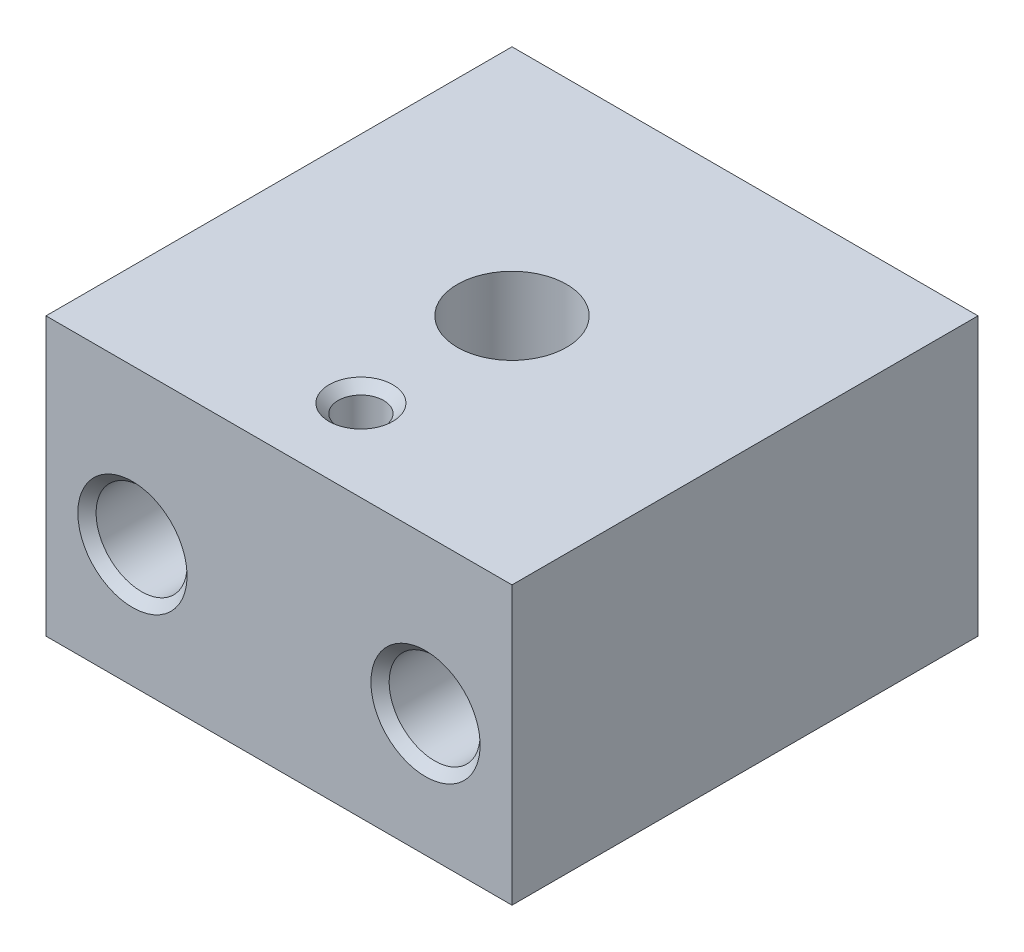
ISO-10303-21;
HEADER;
FILE_DESCRIPTION(('STEP AP214'),'2;1');
FILE_NAME('part.step','',(''),(''),'','','');
FILE_SCHEMA(('AUTOMOTIVE_DESIGN { 1 0 10303 214 1 1 1 1 }'));
ENDSEC;
DATA;
#1=APPLICATION_CONTEXT('core data for automotive mechanical design processes');
#2=APPLICATION_PROTOCOL_DEFINITION('international standard','automotive_design',2000,#1);
#3=PRODUCT_CONTEXT('',#1,'mechanical');
#4=PRODUCT('Part','Part','',(#3));
#5=PRODUCT_RELATED_PRODUCT_CATEGORY('part','',(#4));
#6=PRODUCT_DEFINITION_FORMATION('','',#4);
#7=PRODUCT_DEFINITION_CONTEXT('part definition',#1,'design');
#8=PRODUCT_DEFINITION('design','',#6,#7);
#9=PRODUCT_DEFINITION_SHAPE('','',#8);
#10=(LENGTH_UNIT() NAMED_UNIT(*) SI_UNIT(.MILLI.,.METRE.));
#11=(NAMED_UNIT(*) PLANE_ANGLE_UNIT() SI_UNIT($,.RADIAN.));
#12=(NAMED_UNIT(*) SI_UNIT($,.STERADIAN.) SOLID_ANGLE_UNIT());
#13=UNCERTAINTY_MEASURE_WITH_UNIT(LENGTH_MEASURE(1.E-05),#10,'distance_accuracy_value','');
#14=(GEOMETRIC_REPRESENTATION_CONTEXT(3) GLOBAL_UNCERTAINTY_ASSIGNED_CONTEXT((#13)) GLOBAL_UNIT_ASSIGNED_CONTEXT((#10,
#11,#12)) REPRESENTATION_CONTEXT('',''));
#15=CARTESIAN_POINT('',(0.,0.,0.));
#16=DIRECTION('',(0.,0.,1.));
#17=DIRECTION('',(1.,0.,0.));
#18=AXIS2_PLACEMENT_3D('',#15,#16,#17);
#19=CARTESIAN_POINT('',(-12.8,15.24,-12.8));
#20=DIRECTION('',(1.,0.,0.));
#21=DIRECTION('',(0.,0.,-1.));
#22=AXIS2_PLACEMENT_3D('',#19,#20,#21);
#23=PLANE('',#22);
#24=DIRECTION('',(0.,0.,1.));
#25=VECTOR('',#24,1.);
#26=CARTESIAN_POINT('',(-12.8,0.,-12.8));
#27=LINE('',#26,#25);
#28=CARTESIAN_POINT('',(-12.8,0.,-12.8));
#29=VERTEX_POINT('',#28);
#30=CARTESIAN_POINT('',(-12.8,0.,12.8));
#31=VERTEX_POINT('',#30);
#32=EDGE_CURVE('E112',#29,#31,#27,.T.);
#33=ORIENTED_EDGE('',*,*,#32,.T.);
#34=DIRECTION('',(0.,-1.,0.));
#35=VECTOR('',#34,1.);
#36=CARTESIAN_POINT('',(-12.8,15.24,12.8));
#37=LINE('',#36,#35);
#38=CARTESIAN_POINT('',(-12.8,15.24,12.8));
#39=VERTEX_POINT('',#38);
#40=EDGE_CURVE('E103',#39,#31,#37,.T.);
#41=ORIENTED_EDGE('',*,*,#40,.F.);
#42=DIRECTION('',(0.,0.,1.));
#43=VECTOR('',#42,1.);
#44=CARTESIAN_POINT('',(-12.8,15.24,-12.8));
#45=LINE('',#44,#43);
#46=CARTESIAN_POINT('',(-12.8,15.24,-12.8));
#47=VERTEX_POINT('',#46);
#48=EDGE_CURVE('E97',#47,#39,#45,.T.);
#49=ORIENTED_EDGE('',*,*,#48,.F.);
#50=DIRECTION('',(0.,-1.,0.));
#51=VECTOR('',#50,1.);
#52=CARTESIAN_POINT('',(-12.8,15.24,-12.8));
#53=LINE('',#52,#51);
#54=EDGE_CURVE('E108',#47,#29,#53,.T.);
#55=ORIENTED_EDGE('',*,*,#54,.T.);
#56=EDGE_LOOP('',(#33,#41,#49,#55));
#57=FACE_BOUND('',#56,.T.);
#58=ADVANCED_FACE('F44',(#57),#23,.F.);
#59=CARTESIAN_POINT('',(-12.8,15.24,12.8));
#60=DIRECTION('',(0.,0.,-1.));
#61=DIRECTION('',(-1.,0.,0.));
#62=AXIS2_PLACEMENT_3D('',#59,#60,#61);
#63=PLANE('',#62);
#64=CARTESIAN_POINT('',(-8.05,6.74,12.8));
#65=DIRECTION('',(0.,0.,-1.));
#66=DIRECTION('',(-1.,0.,0.));
#67=AXIS2_PLACEMENT_3D('',#64,#65,#66);
#68=CIRCLE('',#67,3.);
#69=CARTESIAN_POINT('',(-11.05,6.74,12.8));
#70=VERTEX_POINT('',#69);
#71=EDGE_CURVE('E144',#70,#70,#68,.T.);
#72=ORIENTED_EDGE('',*,*,#71,.T.);
#73=EDGE_LOOP('',(#72));
#74=FACE_BOUND('',#73,.T.);
#75=CARTESIAN_POINT('',(8.05,6.74,12.8));
#76=DIRECTION('',(0.,0.,-1.));
#77=DIRECTION('',(-1.,0.,0.));
#78=AXIS2_PLACEMENT_3D('',#75,#76,#77);
#79=CIRCLE('',#78,3.);
#80=CARTESIAN_POINT('',(5.05,6.74,12.8));
#81=VERTEX_POINT('',#80);
#82=EDGE_CURVE('E141',#81,#81,#79,.T.);
#83=ORIENTED_EDGE('',*,*,#82,.T.);
#84=EDGE_LOOP('',(#83));
#85=FACE_BOUND('',#84,.T.);
#86=DIRECTION('',(1.,0.,0.));
#87=VECTOR('',#86,1.);
#88=CARTESIAN_POINT('',(-12.8,0.,12.8));
#89=LINE('',#88,#87);
#90=CARTESIAN_POINT('',(12.8,0.,12.8));
#91=VERTEX_POINT('',#90);
#92=EDGE_CURVE('E102',#31,#91,#89,.T.);
#93=ORIENTED_EDGE('',*,*,#92,.T.);
#94=DIRECTION('',(0.,-1.,0.));
#95=VECTOR('',#94,1.);
#96=CARTESIAN_POINT('',(12.8,15.24,12.8));
#97=LINE('',#96,#95);
#98=CARTESIAN_POINT('',(12.8,15.24,12.8));
#99=VERTEX_POINT('',#98);
#100=EDGE_CURVE('E100',#99,#91,#97,.T.);
#101=ORIENTED_EDGE('',*,*,#100,.F.);
#102=DIRECTION('',(1.,0.,0.));
#103=VECTOR('',#102,1.);
#104=CARTESIAN_POINT('',(-12.8,15.24,12.8));
#105=LINE('',#104,#103);
#106=EDGE_CURVE('E92',#39,#99,#105,.T.);
#107=ORIENTED_EDGE('',*,*,#106,.F.);
#108=ORIENTED_EDGE('',*,*,#40,.T.);
#109=EDGE_LOOP('',(#93,#101,#107,#108));
#110=FACE_BOUND('',#109,.T.);
#111=ADVANCED_FACE('F101',(#74,#85,#110),#63,.F.);
#112=CARTESIAN_POINT('',(12.8,15.24,-12.8));
#113=DIRECTION('',(-1.,0.,0.));
#114=DIRECTION('',(0.,0.,1.));
#115=AXIS2_PLACEMENT_3D('',#112,#113,#114);
#116=PLANE('',#115);
#117=DIRECTION('',(0.,0.,-1.));
#118=VECTOR('',#117,1.);
#119=CARTESIAN_POINT('',(12.8,0.,-12.8));
#120=LINE('',#119,#118);
#121=CARTESIAN_POINT('',(12.8,0.,-12.8));
#122=VERTEX_POINT('',#121);
#123=EDGE_CURVE('E78',#91,#122,#120,.T.);
#124=ORIENTED_EDGE('',*,*,#123,.T.);
#125=DIRECTION('',(0.,-1.,0.));
#126=VECTOR('',#125,1.);
#127=CARTESIAN_POINT('',(12.8,15.24,-12.8));
#128=LINE('',#127,#126);
#129=CARTESIAN_POINT('',(12.8,15.24,-12.8));
#130=VERTEX_POINT('',#129);
#131=EDGE_CURVE('E104',#130,#122,#128,.T.);
#132=ORIENTED_EDGE('',*,*,#131,.F.);
#133=DIRECTION('',(0.,0.,-1.));
#134=VECTOR('',#133,1.);
#135=CARTESIAN_POINT('',(12.8,15.24,-12.8));
#136=LINE('',#135,#134);
#137=EDGE_CURVE('E95',#99,#130,#136,.T.);
#138=ORIENTED_EDGE('',*,*,#137,.F.);
#139=ORIENTED_EDGE('',*,*,#100,.T.);
#140=EDGE_LOOP('',(#124,#132,#138,#139));
#141=FACE_BOUND('',#140,.T.);
#142=ADVANCED_FACE('F106',(#141),#116,.F.);
#143=CARTESIAN_POINT('',(-12.8,15.24,-12.8));
#144=DIRECTION('',(0.,0.,1.));
#145=DIRECTION('',(1.,0.,0.));
#146=AXIS2_PLACEMENT_3D('',#143,#144,#145);
#147=PLANE('',#146);
#148=CARTESIAN_POINT('',(-8.05,6.74,-12.8));
#149=DIRECTION('',(0.,0.,1.));
#150=DIRECTION('',(1.,0.,0.));
#151=AXIS2_PLACEMENT_3D('',#148,#149,#150);
#152=CIRCLE('',#151,3.);
#153=CARTESIAN_POINT('',(-5.04999999999999,6.74,-12.8));
#154=VERTEX_POINT('',#153);
#155=EDGE_CURVE('E150',#154,#154,#152,.T.);
#156=ORIENTED_EDGE('',*,*,#155,.T.);
#157=EDGE_LOOP('',(#156));
#158=FACE_BOUND('',#157,.T.);
#159=CARTESIAN_POINT('',(8.05,6.74,-12.8));
#160=DIRECTION('',(0.,0.,1.));
#161=DIRECTION('',(1.,0.,0.));
#162=AXIS2_PLACEMENT_3D('',#159,#160,#161);
#163=CIRCLE('',#162,3.);
#164=CARTESIAN_POINT('',(11.05,6.74,-12.8));
#165=VERTEX_POINT('',#164);
#166=EDGE_CURVE('E147',#165,#165,#163,.T.);
#167=ORIENTED_EDGE('',*,*,#166,.T.);
#168=EDGE_LOOP('',(#167));
#169=FACE_BOUND('',#168,.T.);
#170=DIRECTION('',(-1.,0.,0.));
#171=VECTOR('',#170,1.);
#172=CARTESIAN_POINT('',(-12.8,0.,-12.8));
#173=LINE('',#172,#171);
#174=EDGE_CURVE('E84',#122,#29,#173,.T.);
#175=ORIENTED_EDGE('',*,*,#174,.T.);
#176=ORIENTED_EDGE('',*,*,#54,.F.);
#177=DIRECTION('',(-1.,0.,0.));
#178=VECTOR('',#177,1.);
#179=CARTESIAN_POINT('',(-12.8,15.24,-12.8));
#180=LINE('',#179,#178);
#181=EDGE_CURVE('E61',#130,#47,#180,.T.);
#182=ORIENTED_EDGE('',*,*,#181,.F.);
#183=ORIENTED_EDGE('',*,*,#131,.T.);
#184=EDGE_LOOP('',(#175,#176,#182,#183));
#185=FACE_BOUND('',#184,.T.);
#186=ADVANCED_FACE('F163',(#158,#169,#185),#147,.F.);
#187=CARTESIAN_POINT('',(-12.8,15.24,12.8));
#188=DIRECTION('',(0.,1.,0.));
#189=DIRECTION('',(0.,0.,1.));
#190=AXIS2_PLACEMENT_3D('',#187,#188,#189);
#191=PLANE('',#190);
#192=CARTESIAN_POINT('',(0.,15.24,0.));
#193=DIRECTION('',(0.,1.,0.));
#194=DIRECTION('',(0.,0.,1.));
#195=AXIS2_PLACEMENT_3D('',#192,#193,#194);
#196=CIRCLE('',#195,3.);
#197=CARTESIAN_POINT('',(0.,15.24,3.));
#198=VERTEX_POINT('',#197);
#199=EDGE_CURVE('E232',#198,#198,#196,.T.);
#200=ORIENTED_EDGE('',*,*,#199,.F.);
#201=EDGE_LOOP('',(#200));
#202=FACE_BOUND('',#201,.T.);
#203=CARTESIAN_POINT('',(0.,15.24,8.3));
#204=DIRECTION('',(0.,1.,0.));
#205=DIRECTION('',(0.,0.,1.));
#206=AXIS2_PLACEMENT_3D('',#203,#204,#205);
#207=CIRCLE('',#206,1.75000000000002);
#208=CARTESIAN_POINT('',(0.,15.24,10.05));
#209=VERTEX_POINT('',#208);
#210=EDGE_CURVE('E129',#209,#209,#207,.F.);
#211=ORIENTED_EDGE('',*,*,#210,.T.);
#212=EDGE_LOOP('',(#211));
#213=FACE_BOUND('',#212,.T.);
#214=ORIENTED_EDGE('',*,*,#48,.T.);
#215=ORIENTED_EDGE('',*,*,#106,.T.);
#216=ORIENTED_EDGE('',*,*,#137,.T.);
#217=ORIENTED_EDGE('',*,*,#181,.T.);
#218=EDGE_LOOP('',(#214,#215,#216,#217));
#219=FACE_BOUND('',#218,.T.);
#220=ADVANCED_FACE('F93',(#202,#213,#219),#191,.T.);
#221=CARTESIAN_POINT('',(-12.8,0.,12.8));
#222=DIRECTION('',(0.,1.,0.));
#223=DIRECTION('',(0.,0.,1.));
#224=AXIS2_PLACEMENT_3D('',#221,#222,#223);
#225=PLANE('',#224);
#226=CARTESIAN_POINT('',(0.,0.,0.));
#227=DIRECTION('',(0.,1.,0.));
#228=DIRECTION('',(0.,0.,1.));
#229=AXIS2_PLACEMENT_3D('',#226,#227,#228);
#230=CIRCLE('',#229,3.);
#231=CARTESIAN_POINT('',(0.,0.,3.));
#232=VERTEX_POINT('',#231);
#233=EDGE_CURVE('E114',#232,#232,#230,.T.);
#234=ORIENTED_EDGE('',*,*,#233,.T.);
#235=EDGE_LOOP('',(#234));
#236=FACE_BOUND('',#235,.T.);
#237=CARTESIAN_POINT('',(0.,0.,8.3));
#238=DIRECTION('',(0.,1.,0.));
#239=DIRECTION('',(0.,0.,1.));
#240=AXIS2_PLACEMENT_3D('',#237,#238,#239);
#241=CIRCLE('',#240,1.74999999999998);
#242=CARTESIAN_POINT('',(0.,0.,10.05));
#243=VERTEX_POINT('',#242);
#244=EDGE_CURVE('E132',#243,#243,#241,.T.);
#245=ORIENTED_EDGE('',*,*,#244,.T.);
#246=EDGE_LOOP('',(#245));
#247=FACE_BOUND('',#246,.T.);
#248=ORIENTED_EDGE('',*,*,#32,.F.);
#249=ORIENTED_EDGE('',*,*,#174,.F.);
#250=ORIENTED_EDGE('',*,*,#123,.F.);
#251=ORIENTED_EDGE('',*,*,#92,.F.);
#252=EDGE_LOOP('',(#248,#249,#250,#251));
#253=FACE_BOUND('',#252,.T.);
#254=ADVANCED_FACE('F171',(#236,#247,#253),#225,.F.);
#255=CARTESIAN_POINT('',(-8.05,6.74,-12.8));
#256=DIRECTION('',(0.,0.,1.));
#257=DIRECTION('',(1.,0.,0.));
#258=AXIS2_PLACEMENT_3D('',#255,#256,#257);
#259=CYLINDRICAL_SURFACE('',#258,2.5);
#260=CARTESIAN_POINT('',(-8.05,6.74,12.3));
#261=DIRECTION('',(0.,0.,-1.));
#262=DIRECTION('',(-1.,0.,0.));
#263=AXIS2_PLACEMENT_3D('',#260,#261,#262);
#264=CIRCLE('',#263,2.5);
#265=CARTESIAN_POINT('',(-10.55,6.74,12.3));
#266=VERTEX_POINT('',#265);
#267=EDGE_CURVE('E138',#266,#266,#264,.F.);
#268=ORIENTED_EDGE('',*,*,#267,.T.);
#269=EDGE_LOOP('',(#268));
#270=FACE_BOUND('',#269,.T.);
#271=CARTESIAN_POINT('',(-8.05,6.74,-12.3));
#272=DIRECTION('',(0.,0.,1.));
#273=DIRECTION('',(1.,0.,0.));
#274=AXIS2_PLACEMENT_3D('',#271,#272,#273);
#275=CIRCLE('',#274,2.5);
#276=CARTESIAN_POINT('',(-5.54999999999999,6.74,-12.3));
#277=VERTEX_POINT('',#276);
#278=EDGE_CURVE('E135',#277,#277,#275,.F.);
#279=ORIENTED_EDGE('',*,*,#278,.T.);
#280=EDGE_LOOP('',(#279));
#281=FACE_BOUND('',#280,.T.);
#282=ADVANCED_FACE('F210',(#270,#281),#259,.F.);
#283=CARTESIAN_POINT('',(8.05,6.74,-12.8));
#284=DIRECTION('',(0.,0.,1.));
#285=DIRECTION('',(1.,0.,0.));
#286=AXIS2_PLACEMENT_3D('',#283,#284,#285);
#287=CYLINDRICAL_SURFACE('',#286,2.5);
#288=CARTESIAN_POINT('',(8.05,6.74,12.3));
#289=DIRECTION('',(0.,0.,-1.));
#290=DIRECTION('',(-1.,0.,0.));
#291=AXIS2_PLACEMENT_3D('',#288,#289,#290);
#292=CIRCLE('',#291,2.5);
#293=CARTESIAN_POINT('',(5.55,6.74,12.3));
#294=VERTEX_POINT('',#293);
#295=EDGE_CURVE('E12',#294,#294,#292,.F.);
#296=ORIENTED_EDGE('',*,*,#295,.T.);
#297=EDGE_LOOP('',(#296));
#298=FACE_BOUND('',#297,.T.);
#299=CARTESIAN_POINT('',(8.05,6.74,-12.3));
#300=DIRECTION('',(0.,0.,1.));
#301=DIRECTION('',(1.,0.,0.));
#302=AXIS2_PLACEMENT_3D('',#299,#300,#301);
#303=CIRCLE('',#302,2.5);
#304=CARTESIAN_POINT('',(10.55,6.74,-12.3));
#305=VERTEX_POINT('',#304);
#306=EDGE_CURVE('E53',#305,#305,#303,.F.);
#307=ORIENTED_EDGE('',*,*,#306,.T.);
#308=EDGE_LOOP('',(#307));
#309=FACE_BOUND('',#308,.T.);
#310=ADVANCED_FACE('F155',(#298,#309),#287,.F.);
#311=CARTESIAN_POINT('',(0.,0.,8.3));
#312=DIRECTION('',(0.,1.,0.));
#313=DIRECTION('',(0.,0.,1.));
#314=AXIS2_PLACEMENT_3D('',#311,#312,#313);
#315=CYLINDRICAL_SURFACE('',#314,1.25);
#316=CARTESIAN_POINT('',(0.,14.74,8.3));
#317=DIRECTION('',(0.,1.,0.));
#318=DIRECTION('',(0.,0.,1.));
#319=AXIS2_PLACEMENT_3D('',#316,#317,#318);
#320=CIRCLE('',#319,1.25);
#321=CARTESIAN_POINT('',(0.,14.74,9.55));
#322=VERTEX_POINT('',#321);
#323=EDGE_CURVE('E126',#322,#322,#320,.T.);
#324=CARTESIAN_POINT('',(0.,0.49999999999999,8.3));
#325=DIRECTION('',(0.,1.,0.));
#326=DIRECTION('',(0.,0.,1.));
#327=AXIS2_PLACEMENT_3D('',#324,#325,#326);
#328=CIRCLE('',#327,1.25);
#329=CARTESIAN_POINT('',(0.,0.49999999999999,9.55));
#330=VERTEX_POINT('',#329);
#331=EDGE_CURVE('E123',#330,#330,#328,.F.);
#332=CARTESIAN_POINT('',(0.,14.74,9.55));
#333=CARTESIAN_POINT('',(0.,14.5916666666666,9.55));
#334=CARTESIAN_POINT('',(0.,14.4433333333333,9.55));
#335=CARTESIAN_POINT('',(0.,14.1466666666666,9.55));
#336=CARTESIAN_POINT('',(0.,13.9983333333333,9.55));
#337=CARTESIAN_POINT('',(0.,13.7016666666666,9.55));
#338=CARTESIAN_POINT('',(0.,13.5533333333333,9.55));
#339=CARTESIAN_POINT('',(0.,13.2566666666666,9.55));
#340=CARTESIAN_POINT('',(0.,13.1083333333333,9.55));
#341=CARTESIAN_POINT('',(0.,12.8116666666666,9.55));
#342=CARTESIAN_POINT('',(0.,12.6633333333333,9.55));
#343=CARTESIAN_POINT('',(0.,12.3666666666666,9.55));
#344=CARTESIAN_POINT('',(0.,12.2183333333333,9.55));
#345=CARTESIAN_POINT('',(0.,11.9216666666666,9.55));
#346=CARTESIAN_POINT('',(0.,11.7733333333333,9.55));
#347=CARTESIAN_POINT('',(0.,11.4766666666666,9.55));
#348=CARTESIAN_POINT('',(0.,11.3283333333333,9.55));
#349=CARTESIAN_POINT('',(0.,11.0316666666666,9.55));
#350=CARTESIAN_POINT('',(0.,10.8833333333333,9.55));
#351=CARTESIAN_POINT('',(0.,10.5866666666666,9.55));
#352=CARTESIAN_POINT('',(0.,10.4383333333333,9.55));
#353=CARTESIAN_POINT('',(0.,10.1416666666666,9.55));
#354=CARTESIAN_POINT('',(0.,9.99333333333331,9.55));
#355=CARTESIAN_POINT('',(0.,9.69666666666665,9.55));
#356=CARTESIAN_POINT('',(0.,9.54833333333331,9.55));
#357=CARTESIAN_POINT('',(0.,9.25166666666665,9.55));
#358=CARTESIAN_POINT('',(0.,9.10333333333332,9.55));
#359=CARTESIAN_POINT('',(0.,8.80666666666665,9.55));
#360=CARTESIAN_POINT('',(0.,8.65833333333332,9.55));
#361=CARTESIAN_POINT('',(0.,8.36166666666665,9.55));
#362=CARTESIAN_POINT('',(0.,8.21333333333332,9.55));
#363=CARTESIAN_POINT('',(0.,7.91666666666665,9.55));
#364=CARTESIAN_POINT('',(0.,7.76833333333332,9.55));
#365=CARTESIAN_POINT('',(0.,7.47166666666665,9.55));
#366=CARTESIAN_POINT('',(0.,7.32333333333332,9.55));
#367=CARTESIAN_POINT('',(0.,7.02666666666665,9.55));
#368=CARTESIAN_POINT('',(0.,6.87833333333332,9.55));
#369=CARTESIAN_POINT('',(0.,6.58166666666665,9.55));
#370=CARTESIAN_POINT('',(0.,6.43333333333332,9.55));
#371=CARTESIAN_POINT('',(0.,6.13666666666665,9.55));
#372=CARTESIAN_POINT('',(0.,5.98833333333332,9.55));
#373=CARTESIAN_POINT('',(0.,5.69166666666665,9.55));
#374=CARTESIAN_POINT('',(0.,5.54333333333332,9.55));
#375=CARTESIAN_POINT('',(0.,5.24666666666665,9.55));
#376=CARTESIAN_POINT('',(0.,5.09833333333332,9.55));
#377=CARTESIAN_POINT('',(0.,4.80166666666665,9.55));
#378=CARTESIAN_POINT('',(0.,4.65333333333332,9.55));
#379=CARTESIAN_POINT('',(0.,4.35666666666665,9.55));
#380=CARTESIAN_POINT('',(0.,4.20833333333332,9.55));
#381=CARTESIAN_POINT('',(0.,3.91166666666665,9.55));
#382=CARTESIAN_POINT('',(0.,3.76333333333332,9.55));
#383=CARTESIAN_POINT('',(0.,3.46666666666665,9.55));
#384=CARTESIAN_POINT('',(0.,3.31833333333332,9.55));
#385=CARTESIAN_POINT('',(0.,3.02166666666665,9.55));
#386=CARTESIAN_POINT('',(0.,2.87333333333332,9.55));
#387=CARTESIAN_POINT('',(0.,2.57666666666665,9.55));
#388=CARTESIAN_POINT('',(0.,2.42833333333332,9.55));
#389=CARTESIAN_POINT('',(0.,2.13166666666666,9.55));
#390=CARTESIAN_POINT('',(0.,1.98333333333332,9.55));
#391=CARTESIAN_POINT('',(0.,1.68666666666666,9.55));
#392=CARTESIAN_POINT('',(0.,1.53833333333332,9.55));
#393=CARTESIAN_POINT('',(0.,1.24166666666666,9.55));
#394=CARTESIAN_POINT('',(0.,1.09333333333332,9.55));
#395=CARTESIAN_POINT('',(0.,0.796666666666656,9.55));
#396=CARTESIAN_POINT('',(0.,0.648333333333323,9.55));
#397=CARTESIAN_POINT('',(0.,0.49999999999999,9.55));
#398=B_SPLINE_CURVE_WITH_KNOTS('',3,(#332,#333,#334,#335,#336,#337,#338,#339,#340,#341,#342,
#343,#344,#345,#346,#347,#348,#349,#350,#351,#352,#353,#354,#355,#356,#357,#358,#359,#360,#361,
#362,#363,#364,#365,#366,#367,#368,#369,#370,#371,#372,#373,#374,#375,#376,#377,#378,#379,#380,
#381,#382,#383,#384,#385,#386,#387,#388,#389,#390,#391,#392,#393,#394,#395,#396,#397),
.UNSPECIFIED.,.F.,.F.,(4,2,2,2,2,2,2,2,2,2,2,2,2,2,2,2,2,2,2,2,2,2,2,2,2,2,2,2,2,2,2,2,4),(0.,
0.444999999999999,0.889999999999998,1.335,1.78,2.225,2.67,3.115,3.56,4.005,4.45,4.895,5.34,
5.78499999999999,6.23,6.675,7.11999999999999,7.56499999999999,8.00999999999999,8.45499999999999,
8.89999999999999,9.34499999999999,9.78999999999999,10.235,10.68,11.125,11.57,12.015,12.46,
12.905,13.35,13.795,14.24),.UNSPECIFIED.);
#399=EDGE_CURVE('BSEAM189',#322,#330,#398,.T.);
#400=ORIENTED_EDGE('',*,*,#323,.T.);
#401=ORIENTED_EDGE('',*,*,#331,.T.);
#402=ORIENTED_EDGE('',*,*,#399,.T.);
#403=ORIENTED_EDGE('',*,*,#399,.F.);
#404=EDGE_LOOP('',(#400,#402,#401,#403));
#405=FACE_BOUND('',#404,.T.);
#406=ADVANCED_FACE('F189',(#405),#315,.F.);
#407=CARTESIAN_POINT('',(0.,14.74,8.3));
#408=DIRECTION('',(0.,1.,0.));
#409=DIRECTION('',(0.,0.,1.));
#410=AXIS2_PLACEMENT_3D('',#407,#408,#409);
#411=CONICAL_SURFACE('',#410,1.25,0.785398163397451);
#412=CARTESIAN_POINT('',(0.,15.24,10.05));
#413=CARTESIAN_POINT('',(0.,15.2347916666667,10.0447916666667));
#414=CARTESIAN_POINT('',(0.,15.2295833333333,10.0395833333334));
#415=CARTESIAN_POINT('',(0.,15.2191666666667,10.0291666666667));
#416=CARTESIAN_POINT('',(0.,15.2139583333333,10.0239583333334));
#417=CARTESIAN_POINT('',(0.,15.2035416666667,10.0135416666667));
#418=CARTESIAN_POINT('',(0.,15.1983333333333,10.0083333333334));
#419=CARTESIAN_POINT('',(0.,15.1879166666667,9.99791666666668));
#420=CARTESIAN_POINT('',(0.,15.1827083333333,9.99270833333335));
#421=CARTESIAN_POINT('',(0.,15.1722916666667,9.98229166666668));
#422=CARTESIAN_POINT('',(0.,15.1670833333333,9.97708333333335));
#423=CARTESIAN_POINT('',(0.,15.1566666666667,9.96666666666668));
#424=CARTESIAN_POINT('',(0.,15.1514583333333,9.96145833333335));
#425=CARTESIAN_POINT('',(0.,15.1410416666667,9.95104166666668));
#426=CARTESIAN_POINT('',(0.,15.1358333333333,9.94583333333335));
#427=CARTESIAN_POINT('',(0.,15.1254166666667,9.93541666666668));
#428=CARTESIAN_POINT('',(0.,15.1202083333333,9.93020833333335));
#429=CARTESIAN_POINT('',(0.,15.1097916666667,9.91979166666668));
#430=CARTESIAN_POINT('',(0.,15.1045833333333,9.91458333333335));
#431=CARTESIAN_POINT('',(0.,15.0941666666667,9.90416666666668));
#432=CARTESIAN_POINT('',(0.,15.0889583333333,9.89895833333335));
#433=CARTESIAN_POINT('',(0.,15.0785416666667,9.88854166666668));
#434=CARTESIAN_POINT('',(0.,15.0733333333333,9.88333333333335));
#435=CARTESIAN_POINT('',(0.,15.0629166666667,9.87291666666668));
#436=CARTESIAN_POINT('',(0.,15.0577083333333,9.86770833333335));
#437=CARTESIAN_POINT('',(0.,15.0472916666667,9.85729166666668));
#438=CARTESIAN_POINT('',(0.,15.0420833333333,9.85208333333335));
#439=CARTESIAN_POINT('',(0.,15.0316666666667,9.84166666666668));
#440=CARTESIAN_POINT('',(0.,15.0264583333333,9.83645833333334));
#441=CARTESIAN_POINT('',(0.,15.0160416666667,9.82604166666668));
#442=CARTESIAN_POINT('',(0.,15.0108333333333,9.82083333333334));
#443=CARTESIAN_POINT('',(0.,15.0004166666667,9.81041666666668));
#444=CARTESIAN_POINT('',(0.,14.9952083333333,9.80520833333334));
#445=CARTESIAN_POINT('',(0.,14.9847916666667,9.79479166666668));
#446=CARTESIAN_POINT('',(0.,14.9795833333333,9.78958333333334));
#447=CARTESIAN_POINT('',(0.,14.9691666666667,9.77916666666667));
#448=CARTESIAN_POINT('',(0.,14.9639583333333,9.77395833333334));
#449=CARTESIAN_POINT('',(0.,14.9535416666667,9.76354166666667));
#450=CARTESIAN_POINT('',(0.,14.9483333333333,9.75833333333334));
#451=CARTESIAN_POINT('',(0.,14.9379166666667,9.74791666666667));
#452=CARTESIAN_POINT('',(0.,14.9327083333333,9.74270833333334));
#453=CARTESIAN_POINT('',(0.,14.9222916666667,9.73229166666667));
#454=CARTESIAN_POINT('',(0.,14.9170833333333,9.72708333333334));
#455=CARTESIAN_POINT('',(0.,14.9066666666667,9.71666666666667));
#456=CARTESIAN_POINT('',(0.,14.9014583333333,9.71145833333334));
#457=CARTESIAN_POINT('',(0.,14.8910416666667,9.70104166666667));
#458=CARTESIAN_POINT('',(0.,14.8858333333333,9.69583333333334));
#459=CARTESIAN_POINT('',(0.,14.8754166666667,9.68541666666667));
#460=CARTESIAN_POINT('',(0.,14.8702083333333,9.68020833333334));
#461=CARTESIAN_POINT('',(0.,14.8597916666667,9.66979166666667));
#462=CARTESIAN_POINT('',(0.,14.8545833333333,9.66458333333334));
#463=CARTESIAN_POINT('',(0.,14.8441666666667,9.65416666666667));
#464=CARTESIAN_POINT('',(0.,14.8389583333333,9.64895833333333));
#465=CARTESIAN_POINT('',(0.,14.8285416666666,9.63854166666667));
#466=CARTESIAN_POINT('',(0.,14.8233333333333,9.63333333333333));
#467=CARTESIAN_POINT('',(0.,14.8129166666666,9.62291666666667));
#468=CARTESIAN_POINT('',(0.,14.8077083333333,9.61770833333333));
#469=CARTESIAN_POINT('',(0.,14.7972916666666,9.60729166666667));
#470=CARTESIAN_POINT('',(0.,14.7920833333333,9.60208333333333));
#471=CARTESIAN_POINT('',(0.,14.7816666666666,9.59166666666667));
#472=CARTESIAN_POINT('',(0.,14.7764583333333,9.58645833333333));
#473=CARTESIAN_POINT('',(0.,14.7660416666666,9.57604166666667));
#474=CARTESIAN_POINT('',(0.,14.7608333333333,9.57083333333333));
#475=CARTESIAN_POINT('',(0.,14.7504166666666,9.56041666666666));
#476=CARTESIAN_POINT('',(0.,14.7452083333333,9.55520833333333));
#477=CARTESIAN_POINT('',(0.,14.74,9.55));
#478=B_SPLINE_CURVE_WITH_KNOTS('',3,(#412,#413,#414,#415,#416,#417,#418,#419,#420,#421,#422,
#423,#424,#425,#426,#427,#428,#429,#430,#431,#432,#433,#434,#435,#436,#437,#438,#439,#440,#441,
#442,#443,#444,#445,#446,#447,#448,#449,#450,#451,#452,#453,#454,#455,#456,#457,#458,#459,#460,
#461,#462,#463,#464,#465,#466,#467,#468,#469,#470,#471,#472,#473,#474,#475,#476,#477),
.UNSPECIFIED.,.F.,.F.,(4,2,2,2,2,2,2,2,2,2,2,2,2,2,2,2,2,2,2,2,2,2,2,2,2,2,2,2,2,2,2,2,4),(0.,
0.0220970869120821,0.0441941738241617,0.0662912607362426,0.0883883476483234,0.110485434560403,
0.132582521472485,0.154679608384565,0.176776695296646,0.198873782208726,0.220970869120806,
0.243067956032887,0.265165042944968,0.287262129857047,0.309359216769128,0.331456303681209,
0.35355339059329,0.37565047750537,0.397747564417452,0.419844651329531,0.441941738241611,
0.464038825153693,0.486135912065773,0.508232998977852,0.530330085889934,0.552427172802014,
0.574524259714095,0.596621346626176,0.618718433538257,0.640815520450336,0.662912607362417,
0.685009694274498,0.707106781186578),.UNSPECIFIED.);
#479=EDGE_CURVE('BSEAM185',#209,#322,#478,.T.);
#480=ORIENTED_EDGE('',*,*,#210,.F.);
#481=ORIENTED_EDGE('',*,*,#323,.F.);
#482=ORIENTED_EDGE('',*,*,#479,.T.);
#483=ORIENTED_EDGE('',*,*,#479,.F.);
#484=EDGE_LOOP('',(#480,#482,#481,#483));
#485=FACE_BOUND('',#484,.T.);
#486=ADVANCED_FACE('F185',(#485),#411,.F.);
#487=CARTESIAN_POINT('',(0.,0.,8.3));
#488=DIRECTION('',(0.,-1.,0.));
#489=DIRECTION('',(0.,0.,-1.));
#490=AXIS2_PLACEMENT_3D('',#487,#488,#489);
#491=CONICAL_SURFACE('',#490,1.74999999999998,0.785398163397442);
#492=ORIENTED_EDGE('',*,*,#331,.F.);
#493=EDGE_LOOP('',(#492));
#494=FACE_BOUND('',#493,.T.);
#495=ORIENTED_EDGE('',*,*,#244,.F.);
#496=EDGE_LOOP('',(#495));
#497=FACE_BOUND('',#496,.T.);
#498=ADVANCED_FACE('F188',(#494,#497),#491,.F.);
#499=CARTESIAN_POINT('',(-8.05,6.74,12.3));
#500=DIRECTION('',(0.,0.,1.));
#501=DIRECTION('',(1.,0.,0.));
#502=AXIS2_PLACEMENT_3D('',#499,#500,#501);
#503=CONICAL_SURFACE('',#502,2.5,0.785398163397449);
#504=ORIENTED_EDGE('',*,*,#71,.F.);
#505=EDGE_LOOP('',(#504));
#506=FACE_BOUND('',#505,.T.);
#507=ORIENTED_EDGE('',*,*,#267,.F.);
#508=EDGE_LOOP('',(#507));
#509=FACE_BOUND('',#508,.T.);
#510=ADVANCED_FACE('F193',(#506,#509),#503,.F.);
#511=CARTESIAN_POINT('',(-8.05,6.74,-12.8));
#512=DIRECTION('',(0.,0.,-1.));
#513=DIRECTION('',(-1.,0.,0.));
#514=AXIS2_PLACEMENT_3D('',#511,#512,#513);
#515=CONICAL_SURFACE('',#514,3.,0.785398163397446);
#516=ORIENTED_EDGE('',*,*,#278,.F.);
#517=EDGE_LOOP('',(#516));
#518=FACE_BOUND('',#517,.T.);
#519=ORIENTED_EDGE('',*,*,#155,.F.);
#520=EDGE_LOOP('',(#519));
#521=FACE_BOUND('',#520,.T.);
#522=ADVANCED_FACE('F197',(#518,#521),#515,.F.);
#523=CARTESIAN_POINT('',(8.05,6.74,12.3));
#524=DIRECTION('',(0.,0.,1.));
#525=DIRECTION('',(1.,0.,0.));
#526=AXIS2_PLACEMENT_3D('',#523,#524,#525);
#527=CONICAL_SURFACE('',#526,2.5,0.78539816339745);
#528=ORIENTED_EDGE('',*,*,#82,.F.);
#529=EDGE_LOOP('',(#528));
#530=FACE_BOUND('',#529,.T.);
#531=ORIENTED_EDGE('',*,*,#295,.F.);
#532=EDGE_LOOP('',(#531));
#533=FACE_BOUND('',#532,.T.);
#534=ADVANCED_FACE('F160',(#530,#533),#527,.F.);
#535=CARTESIAN_POINT('',(8.05,6.74,-12.8));
#536=DIRECTION('',(0.,0.,-1.));
#537=DIRECTION('',(-1.,0.,0.));
#538=AXIS2_PLACEMENT_3D('',#535,#536,#537);
#539=CONICAL_SURFACE('',#538,3.,0.785398163397447);
#540=ORIENTED_EDGE('',*,*,#306,.F.);
#541=EDGE_LOOP('',(#540));
#542=FACE_BOUND('',#541,.T.);
#543=ORIENTED_EDGE('',*,*,#166,.F.);
#544=EDGE_LOOP('',(#543));
#545=FACE_BOUND('',#544,.T.);
#546=ADVANCED_FACE('F46',(#542,#545),#539,.F.);
#547=CARTESIAN_POINT('',(0.,0.,0.));
#548=DIRECTION('',(0.,1.,0.));
#549=DIRECTION('',(0.,0.,1.));
#550=AXIS2_PLACEMENT_3D('',#547,#548,#549);
#551=CYLINDRICAL_SURFACE('',#550,3.);
#552=CARTESIAN_POINT('',(0.,0.,3.));
#553=CARTESIAN_POINT('',(0.,0.15875,3.));
#554=CARTESIAN_POINT('',(0.,0.3175,3.));
#555=CARTESIAN_POINT('',(0.,0.635,3.));
#556=CARTESIAN_POINT('',(0.,0.79375,3.));
#557=CARTESIAN_POINT('',(0.,1.11125,3.));
#558=CARTESIAN_POINT('',(0.,1.27,3.));
#559=CARTESIAN_POINT('',(0.,1.5875,3.));
#560=CARTESIAN_POINT('',(0.,1.74625,3.));
#561=CARTESIAN_POINT('',(0.,2.06375,3.));
#562=CARTESIAN_POINT('',(0.,2.2225,3.));
#563=CARTESIAN_POINT('',(0.,2.54,3.));
#564=CARTESIAN_POINT('',(0.,2.69875,3.));
#565=CARTESIAN_POINT('',(0.,3.01625,3.));
#566=CARTESIAN_POINT('',(0.,3.175,3.));
#567=CARTESIAN_POINT('',(0.,3.4925,3.));
#568=CARTESIAN_POINT('',(0.,3.65125,3.));
#569=CARTESIAN_POINT('',(0.,3.96875,3.));
#570=CARTESIAN_POINT('',(0.,4.1275,3.));
#571=CARTESIAN_POINT('',(0.,4.445,3.));
#572=CARTESIAN_POINT('',(0.,4.60375,3.));
#573=CARTESIAN_POINT('',(0.,4.92125,3.));
#574=CARTESIAN_POINT('',(0.,5.08,3.));
#575=CARTESIAN_POINT('',(0.,5.3975,3.));
#576=CARTESIAN_POINT('',(0.,5.55625,3.));
#577=CARTESIAN_POINT('',(0.,5.87375,3.));
#578=CARTESIAN_POINT('',(0.,6.0325,3.));
#579=CARTESIAN_POINT('',(0.,6.35,3.));
#580=CARTESIAN_POINT('',(0.,6.50875,3.));
#581=CARTESIAN_POINT('',(0.,6.82625,3.));
#582=CARTESIAN_POINT('',(0.,6.985,3.));
#583=CARTESIAN_POINT('',(0.,7.3025,3.));
#584=CARTESIAN_POINT('',(0.,7.46125,3.));
#585=CARTESIAN_POINT('',(0.,7.77875,3.));
#586=CARTESIAN_POINT('',(0.,7.9375,3.));
#587=CARTESIAN_POINT('',(0.,8.255,3.));
#588=CARTESIAN_POINT('',(0.,8.41375,3.));
#589=CARTESIAN_POINT('',(0.,8.73125,3.));
#590=CARTESIAN_POINT('',(0.,8.89,3.));
#591=CARTESIAN_POINT('',(0.,9.2075,3.));
#592=CARTESIAN_POINT('',(0.,9.36625,3.));
#593=CARTESIAN_POINT('',(0.,9.68375,3.));
#594=CARTESIAN_POINT('',(0.,9.8425,3.));
#595=CARTESIAN_POINT('',(0.,10.16,3.));
#596=CARTESIAN_POINT('',(0.,10.31875,3.));
#597=CARTESIAN_POINT('',(0.,10.63625,3.));
#598=CARTESIAN_POINT('',(0.,10.795,3.));
#599=CARTESIAN_POINT('',(0.,11.1125,3.));
#600=CARTESIAN_POINT('',(0.,11.27125,3.));
#601=CARTESIAN_POINT('',(0.,11.58875,3.));
#602=CARTESIAN_POINT('',(0.,11.7475,3.));
#603=CARTESIAN_POINT('',(0.,12.065,3.));
#604=CARTESIAN_POINT('',(0.,12.22375,3.));
#605=CARTESIAN_POINT('',(0.,12.54125,3.));
#606=CARTESIAN_POINT('',(0.,12.7,3.));
#607=CARTESIAN_POINT('',(0.,13.0175,3.));
#608=CARTESIAN_POINT('',(0.,13.17625,3.));
#609=CARTESIAN_POINT('',(0.,13.49375,3.));
#610=CARTESIAN_POINT('',(0.,13.6525,3.));
#611=CARTESIAN_POINT('',(0.,13.97,3.));
#612=CARTESIAN_POINT('',(0.,14.12875,3.));
#613=CARTESIAN_POINT('',(0.,14.44625,3.));
#614=CARTESIAN_POINT('',(0.,14.605,3.));
#615=CARTESIAN_POINT('',(0.,14.9225,3.));
#616=CARTESIAN_POINT('',(0.,15.08125,3.));
#617=CARTESIAN_POINT('',(0.,15.24,3.));
#618=B_SPLINE_CURVE_WITH_KNOTS('',3,(#552,#553,#554,#555,#556,#557,#558,#559,#560,#561,#562,
#563,#564,#565,#566,#567,#568,#569,#570,#571,#572,#573,#574,#575,#576,#577,#578,#579,#580,#581,
#582,#583,#584,#585,#586,#587,#588,#589,#590,#591,#592,#593,#594,#595,#596,#597,#598,#599,#600,
#601,#602,#603,#604,#605,#606,#607,#608,#609,#610,#611,#612,#613,#614,#615,#616,#617),
.UNSPECIFIED.,.F.,.F.,(4,2,2,2,2,2,2,2,2,2,2,2,2,2,2,2,2,2,2,2,2,2,2,2,2,2,2,2,2,2,2,2,4),(0.,
0.47625,0.9525,1.42875,1.905,2.38125,2.8575,3.33375,3.81,4.28625,4.7625,5.23875,5.715,6.19125,
6.6675,7.14375,7.62,8.09625,8.5725,9.04875,9.525,10.00125,10.4775,10.95375,11.43,11.90625,
12.3825,12.85875,13.335,13.81125,14.2875,14.76375,15.24),.UNSPECIFIED.);
#619=EDGE_CURVE('BSEAM159',#232,#198,#618,.T.);
#620=ORIENTED_EDGE('',*,*,#233,.F.);
#621=ORIENTED_EDGE('',*,*,#199,.T.);
#622=ORIENTED_EDGE('',*,*,#619,.T.);
#623=ORIENTED_EDGE('',*,*,#619,.F.);
#624=EDGE_LOOP('',(#620,#622,#621,#623));
#625=FACE_BOUND('',#624,.T.);
#626=ADVANCED_FACE('F159',(#625),#551,.F.);
#627=CLOSED_SHELL('',(#58,#111,#142,#186,#220,#254,#282,#310,#406,#486,#498,#510,#522,#534,#546,#626));
#628=MANIFOLD_SOLID_BREP('B2',#627);
#629=ADVANCED_BREP_SHAPE_REPRESENTATION('',(#18,#628),#14);
#630=SHAPE_DEFINITION_REPRESENTATION(#9,#629);
ENDSEC;
END-ISO-10303-21;
